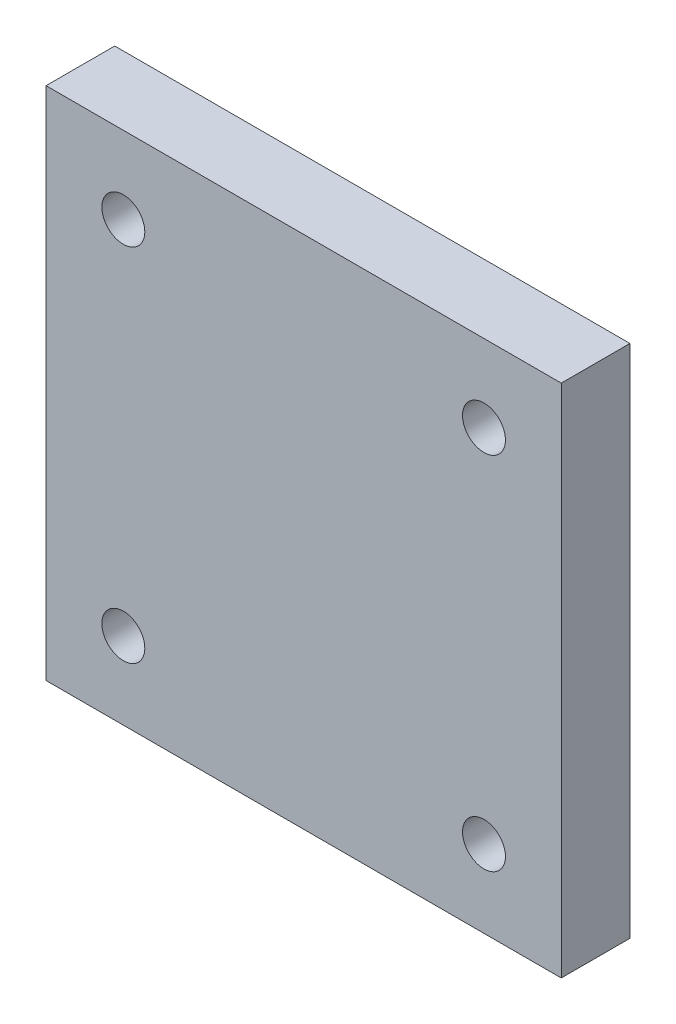
ISO-10303-21;
HEADER;
FILE_DESCRIPTION(('STEP AP214'),'2;1');
FILE_NAME('part.step','',(''),(''),'','','');
FILE_SCHEMA(('AUTOMOTIVE_DESIGN { 1 0 10303 214 1 1 1 1 }'));
ENDSEC;
DATA;
#1=APPLICATION_CONTEXT('core data for automotive mechanical design processes');
#2=APPLICATION_PROTOCOL_DEFINITION('international standard','automotive_design',2000,#1);
#3=PRODUCT_CONTEXT('',#1,'mechanical');
#4=PRODUCT('Part','Part','',(#3));
#5=PRODUCT_RELATED_PRODUCT_CATEGORY('part','',(#4));
#6=PRODUCT_DEFINITION_FORMATION('','',#4);
#7=PRODUCT_DEFINITION_CONTEXT('part definition',#1,'design');
#8=PRODUCT_DEFINITION('design','',#6,#7);
#9=PRODUCT_DEFINITION_SHAPE('','',#8);
#10=(LENGTH_UNIT() NAMED_UNIT(*) SI_UNIT(.MILLI.,.METRE.));
#11=(NAMED_UNIT(*) PLANE_ANGLE_UNIT() SI_UNIT($,.RADIAN.));
#12=(NAMED_UNIT(*) SI_UNIT($,.STERADIAN.) SOLID_ANGLE_UNIT());
#13=UNCERTAINTY_MEASURE_WITH_UNIT(LENGTH_MEASURE(1.E-05),#10,'distance_accuracy_value','');
#14=(GEOMETRIC_REPRESENTATION_CONTEXT(3) GLOBAL_UNCERTAINTY_ASSIGNED_CONTEXT((#13)) GLOBAL_UNIT_ASSIGNED_CONTEXT((#10,
#11,#12)) REPRESENTATION_CONTEXT('',''));
#15=CARTESIAN_POINT('',(0.,0.,0.));
#16=DIRECTION('',(0.,0.,1.));
#17=DIRECTION('',(1.,0.,0.));
#18=AXIS2_PLACEMENT_3D('',#15,#16,#17);
#19=CARTESIAN_POINT('',(-10.,300.,8.));
#20=DIRECTION('',(-1.,0.,0.));
#21=DIRECTION('',(0.,-1.,0.));
#22=AXIS2_PLACEMENT_3D('',#19,#20,#21);
#23=PLANE('',#22);
#24=DIRECTION('',(0.,1.,0.));
#25=VECTOR('',#24,1.);
#26=CARTESIAN_POINT('',(-10.,300.,0.));
#27=LINE('',#26,#25);
#28=CARTESIAN_POINT('',(-10.,300.,0.));
#29=VERTEX_POINT('',#28);
#30=CARTESIAN_POINT('',(-10.0000000000001,360.,0.));
#31=VERTEX_POINT('',#30);
#32=EDGE_CURVE('E98',#29,#31,#27,.T.);
#33=ORIENTED_EDGE('',*,*,#32,.T.);
#34=DIRECTION('',(0.,0.,-1.));
#35=VECTOR('',#34,1.);
#36=CARTESIAN_POINT('',(-10.0000000000001,360.,8.));
#37=LINE('',#36,#35);
#38=CARTESIAN_POINT('',(-10.0000000000001,360.,8.));
#39=VERTEX_POINT('',#38);
#40=EDGE_CURVE('E11',#39,#31,#37,.T.);
#41=ORIENTED_EDGE('',*,*,#40,.F.);
#42=DIRECTION('',(0.,1.,0.));
#43=VECTOR('',#42,1.);
#44=CARTESIAN_POINT('',(-10.,300.,8.));
#45=LINE('',#44,#43);
#46=CARTESIAN_POINT('',(-10.,300.,8.));
#47=VERTEX_POINT('',#46);
#48=EDGE_CURVE('E86',#47,#39,#45,.T.);
#49=ORIENTED_EDGE('',*,*,#48,.F.);
#50=DIRECTION('',(0.,0.,-1.));
#51=VECTOR('',#50,1.);
#52=CARTESIAN_POINT('',(-10.,300.,8.));
#53=LINE('',#52,#51);
#54=EDGE_CURVE('E94',#47,#29,#53,.T.);
#55=ORIENTED_EDGE('',*,*,#54,.T.);
#56=EDGE_LOOP('',(#33,#41,#49,#55));
#57=FACE_BOUND('',#56,.T.);
#58=ADVANCED_FACE('F35',(#57),#23,.F.);
#59=CARTESIAN_POINT('',(-70.,360.,8.));
#60=DIRECTION('',(0.,-1.,0.));
#61=DIRECTION('',(0.,0.,-1.));
#62=AXIS2_PLACEMENT_3D('',#59,#60,#61);
#63=PLANE('',#62);
#64=DIRECTION('',(-1.,0.,0.));
#65=VECTOR('',#64,1.);
#66=CARTESIAN_POINT('',(-70.,360.,0.));
#67=LINE('',#66,#65);
#68=CARTESIAN_POINT('',(-70.,360.,0.));
#69=VERTEX_POINT('',#68);
#70=EDGE_CURVE('E90',#31,#69,#67,.T.);
#71=ORIENTED_EDGE('',*,*,#70,.T.);
#72=DIRECTION('',(0.,0.,-1.));
#73=VECTOR('',#72,1.);
#74=CARTESIAN_POINT('',(-70.,360.,8.));
#75=LINE('',#74,#73);
#76=CARTESIAN_POINT('',(-70.,360.,8.));
#77=VERTEX_POINT('',#76);
#78=EDGE_CURVE('E43',#77,#69,#75,.T.);
#79=ORIENTED_EDGE('',*,*,#78,.F.);
#80=DIRECTION('',(-1.,0.,0.));
#81=VECTOR('',#80,1.);
#82=CARTESIAN_POINT('',(-70.,360.,8.));
#83=LINE('',#82,#81);
#84=EDGE_CURVE('E81',#39,#77,#83,.T.);
#85=ORIENTED_EDGE('',*,*,#84,.F.);
#86=ORIENTED_EDGE('',*,*,#40,.T.);
#87=EDGE_LOOP('',(#71,#79,#85,#86));
#88=FACE_BOUND('',#87,.T.);
#89=ADVANCED_FACE('F89',(#88),#63,.F.);
#90=CARTESIAN_POINT('',(-70.,300.,8.));
#91=DIRECTION('',(1.,0.,0.));
#92=DIRECTION('',(0.,0.,-1.));
#93=AXIS2_PLACEMENT_3D('',#90,#91,#92);
#94=PLANE('',#93);
#95=DIRECTION('',(0.,-1.,0.));
#96=VECTOR('',#95,1.);
#97=CARTESIAN_POINT('',(-70.,300.,0.));
#98=LINE('',#97,#96);
#99=CARTESIAN_POINT('',(-70.,300.,0.));
#100=VERTEX_POINT('',#99);
#101=EDGE_CURVE('E68',#69,#100,#98,.T.);
#102=ORIENTED_EDGE('',*,*,#101,.T.);
#103=DIRECTION('',(0.,0.,-1.));
#104=VECTOR('',#103,1.);
#105=CARTESIAN_POINT('',(-70.,300.,8.));
#106=LINE('',#105,#104);
#107=CARTESIAN_POINT('',(-70.,300.,8.));
#108=VERTEX_POINT('',#107);
#109=EDGE_CURVE('E91',#108,#100,#106,.T.);
#110=ORIENTED_EDGE('',*,*,#109,.F.);
#111=DIRECTION('',(0.,-1.,0.));
#112=VECTOR('',#111,1.);
#113=CARTESIAN_POINT('',(-70.,300.,8.));
#114=LINE('',#113,#112);
#115=EDGE_CURVE('E84',#77,#108,#114,.T.);
#116=ORIENTED_EDGE('',*,*,#115,.F.);
#117=ORIENTED_EDGE('',*,*,#78,.T.);
#118=EDGE_LOOP('',(#102,#110,#116,#117));
#119=FACE_BOUND('',#118,.T.);
#120=ADVANCED_FACE('F92',(#119),#94,.F.);
#121=CARTESIAN_POINT('',(-70.,300.,8.));
#122=DIRECTION('',(0.,1.,0.));
#123=DIRECTION('',(0.,0.,1.));
#124=AXIS2_PLACEMENT_3D('',#121,#122,#123);
#125=PLANE('',#124);
#126=DIRECTION('',(1.,0.,0.));
#127=VECTOR('',#126,1.);
#128=CARTESIAN_POINT('',(-70.,300.,0.));
#129=LINE('',#128,#127);
#130=EDGE_CURVE('E74',#100,#29,#129,.T.);
#131=ORIENTED_EDGE('',*,*,#130,.T.);
#132=ORIENTED_EDGE('',*,*,#54,.F.);
#133=DIRECTION('',(1.,0.,0.));
#134=VECTOR('',#133,1.);
#135=CARTESIAN_POINT('',(-70.,300.,8.));
#136=LINE('',#135,#134);
#137=EDGE_CURVE('E51',#108,#47,#136,.T.);
#138=ORIENTED_EDGE('',*,*,#137,.F.);
#139=ORIENTED_EDGE('',*,*,#109,.T.);
#140=EDGE_LOOP('',(#131,#132,#138,#139));
#141=FACE_BOUND('',#140,.T.);
#142=ADVANCED_FACE('F106',(#141),#125,.F.);
#143=CARTESIAN_POINT('',(0.,0.,8.));
#144=DIRECTION('',(0.,0.,-1.));
#145=DIRECTION('',(-1.,0.,0.));
#146=AXIS2_PLACEMENT_3D('',#143,#144,#145);
#147=PLANE('',#146);
#148=CARTESIAN_POINT('',(-19.,351.,8.));
#149=DIRECTION('',(0.,0.,1.));
#150=DIRECTION('',(1.,0.,0.));
#151=AXIS2_PLACEMENT_3D('',#148,#149,#150);
#152=CIRCLE('',#151,2.49999999999999);
#153=CARTESIAN_POINT('',(-16.5000000000001,351.,8.));
#154=VERTEX_POINT('',#153);
#155=EDGE_CURVE('E132',#154,#154,#152,.T.);
#156=ORIENTED_EDGE('',*,*,#155,.F.);
#157=EDGE_LOOP('',(#156));
#158=FACE_BOUND('',#157,.T.);
#159=CARTESIAN_POINT('',(-61.,351.,8.));
#160=DIRECTION('',(0.,0.,1.));
#161=DIRECTION('',(1.,0.,0.));
#162=AXIS2_PLACEMENT_3D('',#159,#160,#161);
#163=CIRCLE('',#162,2.49999999999999);
#164=CARTESIAN_POINT('',(-58.5000000000001,351.,8.));
#165=VERTEX_POINT('',#164);
#166=EDGE_CURVE('E126',#165,#165,#163,.T.);
#167=ORIENTED_EDGE('',*,*,#166,.F.);
#168=EDGE_LOOP('',(#167));
#169=FACE_BOUND('',#168,.T.);
#170=CARTESIAN_POINT('',(-61.,309.,8.));
#171=DIRECTION('',(0.,0.,1.));
#172=DIRECTION('',(1.,0.,0.));
#173=AXIS2_PLACEMENT_3D('',#170,#171,#172);
#174=CIRCLE('',#173,2.49999999999999);
#175=CARTESIAN_POINT('',(-58.5,309.,8.));
#176=VERTEX_POINT('',#175);
#177=EDGE_CURVE('E120',#176,#176,#174,.T.);
#178=ORIENTED_EDGE('',*,*,#177,.F.);
#179=EDGE_LOOP('',(#178));
#180=FACE_BOUND('',#179,.T.);
#181=CARTESIAN_POINT('',(-19.,309.,8.));
#182=DIRECTION('',(0.,0.,1.));
#183=DIRECTION('',(1.,0.,0.));
#184=AXIS2_PLACEMENT_3D('',#181,#182,#183);
#185=CIRCLE('',#184,2.49999999999999);
#186=CARTESIAN_POINT('',(-16.5000000000001,309.,8.));
#187=VERTEX_POINT('',#186);
#188=EDGE_CURVE('E114',#187,#187,#185,.T.);
#189=ORIENTED_EDGE('',*,*,#188,.F.);
#190=EDGE_LOOP('',(#189));
#191=FACE_BOUND('',#190,.T.);
#192=ORIENTED_EDGE('',*,*,#48,.T.);
#193=ORIENTED_EDGE('',*,*,#84,.T.);
#194=ORIENTED_EDGE('',*,*,#115,.T.);
#195=ORIENTED_EDGE('',*,*,#137,.T.);
#196=EDGE_LOOP('',(#192,#193,#194,#195));
#197=FACE_BOUND('',#196,.T.);
#198=ADVANCED_FACE('F82',(#158,#169,#180,#191,#197),#147,.F.);
#199=CARTESIAN_POINT('',(0.,0.,0.));
#200=DIRECTION('',(0.,0.,-1.));
#201=DIRECTION('',(-1.,0.,0.));
#202=AXIS2_PLACEMENT_3D('',#199,#200,#201);
#203=PLANE('',#202);
#204=CARTESIAN_POINT('',(-19.,351.,0.));
#205=DIRECTION('',(0.,0.,1.));
#206=DIRECTION('',(1.,0.,0.));
#207=AXIS2_PLACEMENT_3D('',#204,#205,#206);
#208=CIRCLE('',#207,2.5);
#209=CARTESIAN_POINT('',(-16.5,351.,0.));
#210=VERTEX_POINT('',#209);
#211=EDGE_CURVE('E129',#210,#210,#208,.T.);
#212=ORIENTED_EDGE('',*,*,#211,.T.);
#213=EDGE_LOOP('',(#212));
#214=FACE_BOUND('',#213,.T.);
#215=CARTESIAN_POINT('',(-61.,351.,0.));
#216=DIRECTION('',(0.,0.,1.));
#217=DIRECTION('',(1.,0.,0.));
#218=AXIS2_PLACEMENT_3D('',#215,#216,#217);
#219=CIRCLE('',#218,2.5);
#220=CARTESIAN_POINT('',(-58.5,351.,0.));
#221=VERTEX_POINT('',#220);
#222=EDGE_CURVE('E123',#221,#221,#219,.T.);
#223=ORIENTED_EDGE('',*,*,#222,.T.);
#224=EDGE_LOOP('',(#223));
#225=FACE_BOUND('',#224,.T.);
#226=CARTESIAN_POINT('',(-61.,309.,0.));
#227=DIRECTION('',(0.,0.,1.));
#228=DIRECTION('',(1.,0.,0.));
#229=AXIS2_PLACEMENT_3D('',#226,#227,#228);
#230=CIRCLE('',#229,2.5);
#231=CARTESIAN_POINT('',(-58.5,309.,0.));
#232=VERTEX_POINT('',#231);
#233=EDGE_CURVE('E117',#232,#232,#230,.T.);
#234=ORIENTED_EDGE('',*,*,#233,.T.);
#235=EDGE_LOOP('',(#234));
#236=FACE_BOUND('',#235,.T.);
#237=CARTESIAN_POINT('',(-19.,309.,0.));
#238=DIRECTION('',(0.,0.,1.));
#239=DIRECTION('',(1.,0.,0.));
#240=AXIS2_PLACEMENT_3D('',#237,#238,#239);
#241=CIRCLE('',#240,2.5);
#242=CARTESIAN_POINT('',(-16.5,309.,0.));
#243=VERTEX_POINT('',#242);
#244=EDGE_CURVE('E101',#243,#243,#241,.T.);
#245=ORIENTED_EDGE('',*,*,#244,.T.);
#246=EDGE_LOOP('',(#245));
#247=FACE_BOUND('',#246,.T.);
#248=ORIENTED_EDGE('',*,*,#32,.F.);
#249=ORIENTED_EDGE('',*,*,#130,.F.);
#250=ORIENTED_EDGE('',*,*,#101,.F.);
#251=ORIENTED_EDGE('',*,*,#70,.F.);
#252=EDGE_LOOP('',(#248,#249,#250,#251));
#253=FACE_BOUND('',#252,.T.);
#254=ADVANCED_FACE('F109',(#214,#225,#236,#247,#253),#203,.T.);
#255=CARTESIAN_POINT('',(-19.,309.,8.));
#256=DIRECTION('',(0.,0.,1.));
#257=DIRECTION('',(1.,0.,0.));
#258=AXIS2_PLACEMENT_3D('',#255,#256,#257);
#259=CYLINDRICAL_SURFACE('',#258,2.49999999999999);
#260=ORIENTED_EDGE('',*,*,#244,.F.);
#261=EDGE_LOOP('',(#260));
#262=FACE_BOUND('',#261,.T.);
#263=ORIENTED_EDGE('',*,*,#188,.T.);
#264=EDGE_LOOP('',(#263));
#265=FACE_BOUND('',#264,.T.);
#266=ADVANCED_FACE('F147',(#262,#265),#259,.F.);
#267=CARTESIAN_POINT('',(-61.,309.,8.));
#268=DIRECTION('',(0.,0.,1.));
#269=DIRECTION('',(1.,0.,0.));
#270=AXIS2_PLACEMENT_3D('',#267,#268,#269);
#271=CYLINDRICAL_SURFACE('',#270,2.49999999999999);
#272=ORIENTED_EDGE('',*,*,#233,.F.);
#273=EDGE_LOOP('',(#272));
#274=FACE_BOUND('',#273,.T.);
#275=ORIENTED_EDGE('',*,*,#177,.T.);
#276=EDGE_LOOP('',(#275));
#277=FACE_BOUND('',#276,.T.);
#278=ADVANCED_FACE('F149',(#274,#277),#271,.F.);
#279=CARTESIAN_POINT('',(-61.,351.,8.));
#280=DIRECTION('',(0.,0.,1.));
#281=DIRECTION('',(1.,0.,0.));
#282=AXIS2_PLACEMENT_3D('',#279,#280,#281);
#283=CYLINDRICAL_SURFACE('',#282,2.49999999999999);
#284=ORIENTED_EDGE('',*,*,#222,.F.);
#285=EDGE_LOOP('',(#284));
#286=FACE_BOUND('',#285,.T.);
#287=ORIENTED_EDGE('',*,*,#166,.T.);
#288=EDGE_LOOP('',(#287));
#289=FACE_BOUND('',#288,.T.);
#290=ADVANCED_FACE('F156',(#286,#289),#283,.F.);
#291=CARTESIAN_POINT('',(-19.,351.,8.));
#292=DIRECTION('',(0.,0.,1.));
#293=DIRECTION('',(1.,0.,0.));
#294=AXIS2_PLACEMENT_3D('',#291,#292,#293);
#295=CYLINDRICAL_SURFACE('',#294,2.49999999999999);
#296=ORIENTED_EDGE('',*,*,#211,.F.);
#297=EDGE_LOOP('',(#296));
#298=FACE_BOUND('',#297,.T.);
#299=ORIENTED_EDGE('',*,*,#155,.T.);
#300=EDGE_LOOP('',(#299));
#301=FACE_BOUND('',#300,.T.);
#302=ADVANCED_FACE('F136',(#298,#301),#295,.F.);
#303=CLOSED_SHELL('',(#58,#89,#120,#142,#198,#254,#266,#278,#290,#302));
#304=MANIFOLD_SOLID_BREP('B2',#303);
#305=ADVANCED_BREP_SHAPE_REPRESENTATION('',(#18,#304),#14);
#306=SHAPE_DEFINITION_REPRESENTATION(#9,#305);
ENDSEC;
END-ISO-10303-21;
